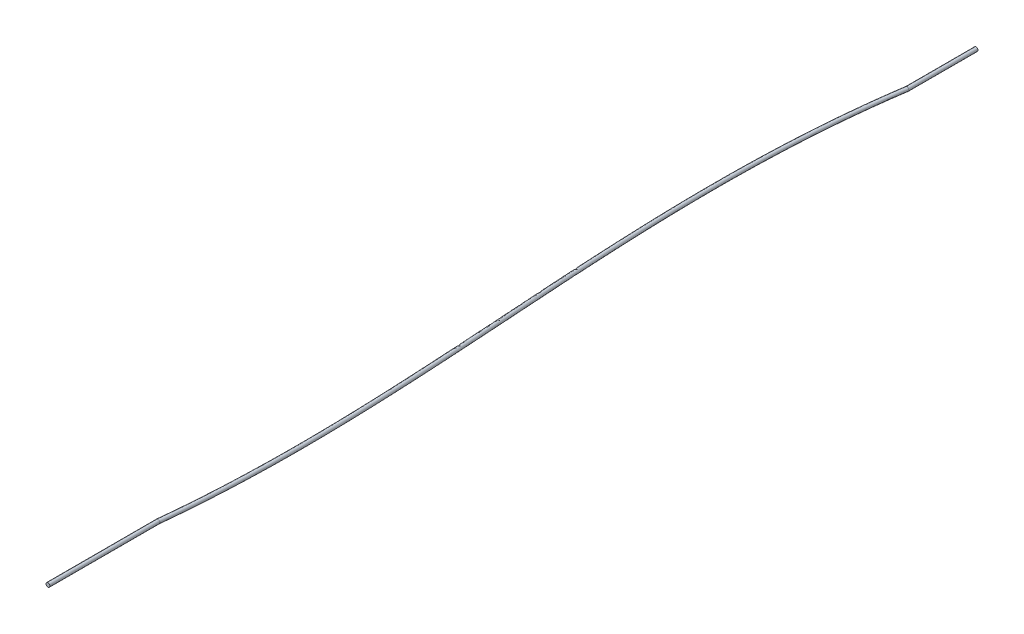
ISO-10303-21;
HEADER;
FILE_DESCRIPTION(('STEP AP214'),'2;1');
FILE_NAME('part.step','',(''),(''),'','','');
FILE_SCHEMA(('AUTOMOTIVE_DESIGN { 1 0 10303 214 1 1 1 1 }'));
ENDSEC;
DATA;
#1=APPLICATION_CONTEXT('core data for automotive mechanical design processes');
#2=APPLICATION_PROTOCOL_DEFINITION('international standard','automotive_design',2000,#1);
#3=PRODUCT_CONTEXT('',#1,'mechanical');
#4=PRODUCT('Part','Part','',(#3));
#5=PRODUCT_RELATED_PRODUCT_CATEGORY('part','',(#4));
#6=PRODUCT_DEFINITION_FORMATION('','',#4);
#7=PRODUCT_DEFINITION_CONTEXT('part definition',#1,'design');
#8=PRODUCT_DEFINITION('design','',#6,#7);
#9=PRODUCT_DEFINITION_SHAPE('','',#8);
#10=(LENGTH_UNIT() NAMED_UNIT(*) SI_UNIT(.MILLI.,.METRE.));
#11=(NAMED_UNIT(*) PLANE_ANGLE_UNIT() SI_UNIT($,.RADIAN.));
#12=(NAMED_UNIT(*) SI_UNIT($,.STERADIAN.) SOLID_ANGLE_UNIT());
#13=UNCERTAINTY_MEASURE_WITH_UNIT(LENGTH_MEASURE(1.E-05),#10,'distance_accuracy_value','');
#14=(GEOMETRIC_REPRESENTATION_CONTEXT(3) GLOBAL_UNCERTAINTY_ASSIGNED_CONTEXT((#13)) GLOBAL_UNIT_ASSIGNED_CONTEXT((#10,
#11,#12)) REPRESENTATION_CONTEXT('',''));
#15=CARTESIAN_POINT('',(0.,0.,0.));
#16=DIRECTION('',(0.,0.,1.));
#17=DIRECTION('',(1.,0.,0.));
#18=AXIS2_PLACEMENT_3D('',#15,#16,#17);
#19=CARTESIAN_POINT('',(0.,0.,0.));
#20=DIRECTION('',(0.,0.,1.));
#21=DIRECTION('',(1.,0.,0.));
#22=AXIS2_PLACEMENT_3D('',#19,#20,#21);
#23=PLANE('',#22);
#24=CARTESIAN_POINT('',(0.,0.,0.));
#25=DIRECTION('',(0.,0.,1.));
#26=DIRECTION('',(1.,0.,0.));
#27=AXIS2_PLACEMENT_3D('',#24,#25,#26);
#28=CIRCLE('',#27,0.1);
#29=CARTESIAN_POINT('',(0.1,0.,0.));
#30=VERTEX_POINT('',#29);
#31=EDGE_CURVE('E49',#30,#30,#28,.T.);
#32=ORIENTED_EDGE('',*,*,#31,.F.);
#33=EDGE_LOOP('',(#32));
#34=FACE_BOUND('',#33,.T.);
#35=ADVANCED_FACE('F34',(#34),#23,.F.);
#36=CARTESIAN_POINT('',(0.,0.,48.));
#37=DIRECTION('',(0.,0.,1.));
#38=DIRECTION('',(1.,0.,0.));
#39=AXIS2_PLACEMENT_3D('',#36,#37,#38);
#40=PLANE('',#39);
#41=CARTESIAN_POINT('',(0.,0.,48.));
#42=DIRECTION('',(0.,0.,1.));
#43=DIRECTION('',(1.,0.,0.));
#44=AXIS2_PLACEMENT_3D('',#41,#42,#43);
#45=CIRCLE('',#44,0.1);
#46=CARTESIAN_POINT('',(0.100000000000005,0.,48.));
#47=VERTEX_POINT('',#46);
#48=EDGE_CURVE('E43',#47,#47,#45,.T.);
#49=ORIENTED_EDGE('',*,*,#48,.T.);
#50=EDGE_LOOP('',(#49));
#51=FACE_BOUND('',#50,.T.);
#52=ADVANCED_FACE('F119',(#51),#40,.T.);
#53=CARTESIAN_POINT('',(0.,0.,3.56165071102266));
#54=DIRECTION('',(0.,0.,-1.));
#55=DIRECTION('',(-1.,0.,0.));
#56=AXIS2_PLACEMENT_3D('',#53,#54,#55);
#57=CYLINDRICAL_SURFACE('',#56,0.1);
#58=ORIENTED_EDGE('',*,*,#31,.T.);
#59=EDGE_LOOP('',(#58));
#60=FACE_BOUND('',#59,.T.);
#61=CARTESIAN_POINT('',(0.,0.,3.56165071102266));
#62=DIRECTION('',(-0.147221913542145,0.,0.989103487089692));
#63=DIRECTION('',(0.989103487089692,0.,0.147221913542145));
#64=AXIS2_PLACEMENT_3D('',#61,#62,#63);
#65=CIRCLE('',#64,0.1);
#66=CARTESIAN_POINT('',(0.099455174354485,0.,3.56901180669977));
#67=VERTEX_POINT('',#66);
#68=EDGE_CURVE('E37',#67,#67,#65,.T.);
#69=ORIENTED_EDGE('',*,*,#68,.F.);
#70=EDGE_LOOP('',(#69));
#71=FACE_BOUND('',#70,.T.);
#72=ADVANCED_FACE('F88',(#60,#71),#57,.T.);
#73=CARTESIAN_POINT('',(0.0994676647462652,0.,42.3182043732893));
#74=CARTESIAN_POINT('',(1.44081003278628,0.,29.3705022269425));
#75=CARTESIAN_POINT('',(-1.82465370555914,0.,16.4997473654457));
#76=CARTESIAN_POINT('',(0.0989103487089697,0.,3.57637290237687));
#77=CARTESIAN_POINT('',(0.0994676647462652,0.2,42.3182043732893));
#78=CARTESIAN_POINT('',(1.44081003278628,0.2,29.3705022269425));
#79=CARTESIAN_POINT('',(-1.82465370555914,0.2,16.4997473654457));
#80=CARTESIAN_POINT('',(0.0989103487089697,0.2,3.57637290237687));
#81=CARTESIAN_POINT('',(-0.0994676647462562,0.2,42.2975952811282));
#82=CARTESIAN_POINT('',(1.23703664207912,0.2,29.3965939455273));
#83=CARTESIAN_POINT('',(-2.03016002333933,0.2,16.5219384611953));
#84=CARTESIAN_POINT('',(-0.0989103487089688,0.2,3.54692851966844));
#85=CARTESIAN_POINT('',(-0.0994676647462562,0.,42.2975952811282));
#86=CARTESIAN_POINT('',(1.23703664207908,0.,29.3965939455273));
#87=CARTESIAN_POINT('',(-2.03016002333933,0.,16.5219384611953));
#88=CARTESIAN_POINT('',(-0.0989103487089688,0.,3.54692851966844));
#89=CARTESIAN_POINT('',(-0.0994676647462562,-0.2,42.2975952811282));
#90=CARTESIAN_POINT('',(1.23703664207903,-0.2,29.3965939455273));
#91=CARTESIAN_POINT('',(-2.03016002333933,-0.2,16.5219384611953));
#92=CARTESIAN_POINT('',(-0.0989103487089688,-0.2,3.54692851966844));
#93=CARTESIAN_POINT('',(0.0994676647462652,-0.2,42.3182043732893));
#94=CARTESIAN_POINT('',(1.44081003278628,-0.2,29.3705022269425));
#95=CARTESIAN_POINT('',(-1.82465370555914,-0.2,16.4997473654457));
#96=CARTESIAN_POINT('',(0.0989103487089697,-0.2,3.57637290237687));
#97=CARTESIAN_POINT('',(0.0994676647462652,0.,42.3182043732893));
#98=CARTESIAN_POINT('',(1.44081003278628,0.,29.3705022269425));
#99=CARTESIAN_POINT('',(-1.82465370555914,0.,16.4997473654457));
#100=CARTESIAN_POINT('',(0.0989103487089697,0.,3.57637290237687));
#101=(BOUNDED_SURFACE() B_SPLINE_SURFACE(3,3,((#73,#74,#75,#76),(#77,#78,#79,#80),(#81,#82,#83,
#84),(#85,#86,#87,#88),(#89,#90,#91,#92),(#93,#94,#95,#96),(#97,#98,#99,#100)),.UNSPECIFIED.,
.T.,.F.,.F.) B_SPLINE_SURFACE_WITH_KNOTS((4,3,4),(4,4),(0.,0.5,1.),(0.,1.),
.UNSPECIFIED.) GEOMETRIC_REPRESENTATION_ITEM() RATIONAL_B_SPLINE_SURFACE(((1.,1.,1.,1.),
(0.333333333333333,0.333333333333333,0.333333333333333,0.333333333333333),(0.333333333333333,
0.333333333333333,0.333333333333333,0.333333333333333),(1.,1.,1.,1.),(0.333333333333333,
0.333333333333333,0.333333333333333,0.333333333333333),(0.333333333333333,0.333333333333333,
0.333333333333333,0.333333333333333),(1.,1.,1.,1.))) REPRESENTATION_ITEM('') SURFACE());
#102=CARTESIAN_POINT('',(0.,0.,42.3078998272088));
#103=DIRECTION('',(0.,0.,1.));
#104=DIRECTION('',(1.,0.,0.));
#105=AXIS2_PLACEMENT_3D('',#102,#103,#104);
#106=CIRCLE('',#105,0.1);
#107=CARTESIAN_POINT('',(0.0997338323731345,0.,42.313052100249));
#108=VERTEX_POINT('',#107);
#109=EDGE_CURVE('E11',#108,#108,#106,.T.);
#110=CARTESIAN_POINT('',(0.0989847814937708,0.,42.322865546062));
#111=CARTESIAN_POINT('',(0.0991457425779356,0.,42.3213118218044));
#112=CARTESIAN_POINT('',(0.0993067036621004,0.,42.3197580975468));
#113=CARTESIAN_POINT('',(0.0994676647462652,0.,42.3182043732893));
#114=CARTESIAN_POINT('',(1.44081003278628,0.,29.3705022269425));
#115=CARTESIAN_POINT('',(-1.82465370555914,0.,16.4997473654457));
#116=CARTESIAN_POINT('',(0.0989103487089697,0.,3.57637290237687));
#117=CARTESIAN_POINT('',(0.0989847814937708,0.2,42.322865546062));
#118=CARTESIAN_POINT('',(0.0991457425779356,0.2,42.3213118218044));
#119=CARTESIAN_POINT('',(0.0993067036621004,0.2,42.3197580975468));
#120=CARTESIAN_POINT('',(0.0994676647462652,0.2,42.3182043732893));
#121=CARTESIAN_POINT('',(1.44081003278628,0.2,29.3705022269425));
#122=CARTESIAN_POINT('',(-1.82465370555914,0.2,16.4997473654457));
#123=CARTESIAN_POINT('',(0.0989103487089697,0.2,3.57637290237687));
#124=CARTESIAN_POINT('',(-0.0999488062967133,0.2,42.3022396416091));
#125=CARTESIAN_POINT('',(-0.0997884257798943,0.2,42.3006915214488));
#126=CARTESIAN_POINT('',(-0.0996280452630752,0.2,42.2991434012885));
#127=CARTESIAN_POINT('',(-0.0994676647462562,0.2,42.2975952811282));
#128=CARTESIAN_POINT('',(1.23703664207912,0.2,29.3965939455273));
#129=CARTESIAN_POINT('',(-2.03016002333933,0.2,16.5219384611953));
#130=CARTESIAN_POINT('',(-0.0989103487089688,0.2,3.54692851966844));
#131=CARTESIAN_POINT('',(-0.0999488062967133,0.,42.3022396416091));
#132=CARTESIAN_POINT('',(-0.0997884257798943,0.,42.3006915214488));
#133=CARTESIAN_POINT('',(-0.0996280452630752,0.,42.2991434012885));
#134=CARTESIAN_POINT('',(-0.0994676647462562,0.,42.2975952811282));
#135=CARTESIAN_POINT('',(1.23703664207908,0.,29.3965939455273));
#136=CARTESIAN_POINT('',(-2.03016002333933,0.,16.5219384611953));
#137=CARTESIAN_POINT('',(-0.0989103487089688,0.,3.54692851966844));
#138=CARTESIAN_POINT('',(-0.0999488062967133,-0.2,42.3022396416091));
#139=CARTESIAN_POINT('',(-0.0997884257798943,-0.2,42.3006915214488));
#140=CARTESIAN_POINT('',(-0.0996280452630753,-0.2,42.2991434012885));
#141=CARTESIAN_POINT('',(-0.0994676647462562,-0.2,42.2975952811282));
#142=CARTESIAN_POINT('',(1.23703664207903,-0.2,29.3965939455273));
#143=CARTESIAN_POINT('',(-2.03016002333933,-0.2,16.5219384611953));
#144=CARTESIAN_POINT('',(-0.0989103487089688,-0.2,3.54692851966844));
#145=CARTESIAN_POINT('',(0.0989847814937708,-0.2,42.322865546062));
#146=CARTESIAN_POINT('',(0.0991457425779356,-0.2,42.3213118218044));
#147=CARTESIAN_POINT('',(0.0993067036621004,-0.2,42.3197580975468));
#148=CARTESIAN_POINT('',(0.0994676647462652,-0.2,42.3182043732893));
#149=CARTESIAN_POINT('',(1.44081003278628,-0.2,29.3705022269425));
#150=CARTESIAN_POINT('',(-1.82465370555914,-0.2,16.4997473654457));
#151=CARTESIAN_POINT('',(0.0989103487089697,-0.2,3.57637290237687));
#152=CARTESIAN_POINT('',(0.0989847814937708,0.,42.322865546062));
#153=CARTESIAN_POINT('',(0.0991457425779356,0.,42.3213118218044));
#154=CARTESIAN_POINT('',(0.0993067036621004,0.,42.3197580975468));
#155=CARTESIAN_POINT('',(0.0994676647462652,0.,42.3182043732893));
#156=CARTESIAN_POINT('',(1.44081003278628,0.,29.3705022269425));
#157=CARTESIAN_POINT('',(-1.82465370555914,0.,16.4997473654457));
#158=CARTESIAN_POINT('',(0.0989103487089697,0.,3.57637290237687));
#159=(BOUNDED_SURFACE() B_SPLINE_SURFACE(3,3,((#110,#111,#112,#113,#114,#115,#116),(#117,#118,
#119,#120,#121,#122,#123),(#124,#125,#126,#127,#128,#129,#130),(#131,#132,#133,#134,#135,#136,
#137),(#138,#139,#140,#141,#142,#143,#144),(#145,#146,#147,#148,#149,#150,#151),(#152,#153,#154,
#155,#156,#157,#158)),.UNSPECIFIED.,.T.,.F.,.F.) B_SPLINE_SURFACE_WITH_KNOTS((4,3,4),(4,3,4),
(0.,0.5,1.),(-0.00012,0.,1.),
.UNSPECIFIED.) GEOMETRIC_REPRESENTATION_ITEM() RATIONAL_B_SPLINE_SURFACE(((1.,1.,1.,1.,1.,1.,
1.),(0.333333333333333,0.333333333333333,0.333333333333333,0.333333333333333,0.333333333333333,
0.333333333333333,0.333333333333333),(0.333333333333333,0.333333333333333,0.333333333333333,
0.333333333333333,0.333333333333333,0.333333333333333,0.333333333333333),(1.,1.,1.,1.,1.,1.,1.),
(0.333333333333333,0.333333333333333,0.333333333333333,0.333333333333333,0.333333333333333,
0.333333333333333,0.333333333333333),(0.333333333333333,0.333333333333333,0.333333333333333,
0.333333333333333,0.333333333333333,0.333333333333333,0.333333333333333),(1.,1.,1.,1.,1.,1.,1.))) REPRESENTATION_ITEM('') SURFACE());
#160=ORIENTED_EDGE('',*,*,#68,.T.);
#161=EDGE_LOOP('',(#160));
#162=FACE_BOUND('',#161,.T.);
#163=ORIENTED_EDGE('',*,*,#109,.F.);
#164=EDGE_LOOP('',(#163));
#165=FACE_BOUND('',#164,.T.);
#166=ADVANCED_FACE('F82',(#162,#165),#159,.F.);
#167=CARTESIAN_POINT('',(0.,0.,48.));
#168=DIRECTION('',(0.,0.,-1.));
#169=DIRECTION('',(-1.,0.,0.));
#170=AXIS2_PLACEMENT_3D('',#167,#168,#169);
#171=CYLINDRICAL_SURFACE('',#170,0.1);
#172=ORIENTED_EDGE('',*,*,#109,.T.);
#173=EDGE_LOOP('',(#172));
#174=FACE_BOUND('',#173,.T.);
#175=ORIENTED_EDGE('',*,*,#48,.F.);
#176=EDGE_LOOP('',(#175));
#177=FACE_BOUND('',#176,.T.);
#178=ADVANCED_FACE('F62',(#174,#177),#171,.T.);
#179=CLOSED_SHELL('',(#35,#52,#72,#166,#178));
#180=MANIFOLD_SOLID_BREP('B2',#179);
#181=ADVANCED_BREP_SHAPE_REPRESENTATION('',(#18,#180),#14);
#182=SHAPE_DEFINITION_REPRESENTATION(#9,#181);
ENDSEC;
END-ISO-10303-21;
